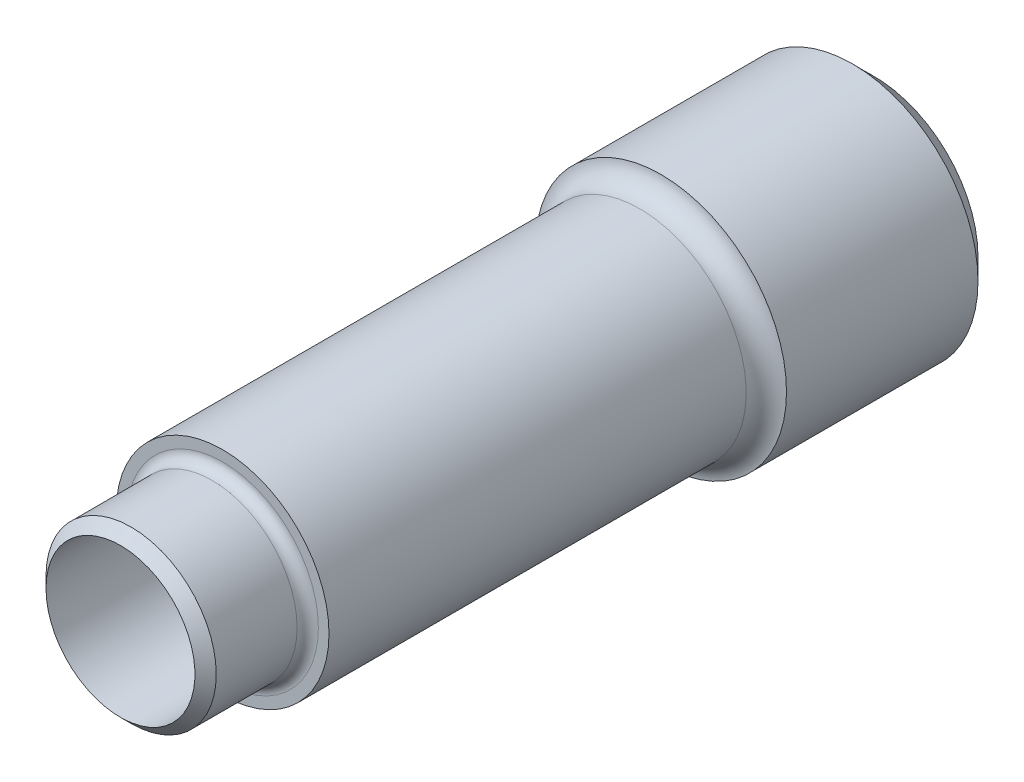
ISO-10303-21;
HEADER;
FILE_DESCRIPTION(('STEP AP214'),'2;1');
FILE_NAME('part.step','',(''),(''),'','','');
FILE_SCHEMA(('AUTOMOTIVE_DESIGN { 1 0 10303 214 1 1 1 1 }'));
ENDSEC;
DATA;
#1=APPLICATION_CONTEXT('core data for automotive mechanical design processes');
#2=APPLICATION_PROTOCOL_DEFINITION('international standard','automotive_design',2000,#1);
#3=PRODUCT_CONTEXT('',#1,'mechanical');
#4=PRODUCT('Part','Part','',(#3));
#5=PRODUCT_RELATED_PRODUCT_CATEGORY('part','',(#4));
#6=PRODUCT_DEFINITION_FORMATION('','',#4);
#7=PRODUCT_DEFINITION_CONTEXT('part definition',#1,'design');
#8=PRODUCT_DEFINITION('design','',#6,#7);
#9=PRODUCT_DEFINITION_SHAPE('','',#8);
#10=(LENGTH_UNIT() NAMED_UNIT(*) SI_UNIT(.MILLI.,.METRE.));
#11=(NAMED_UNIT(*) PLANE_ANGLE_UNIT() SI_UNIT($,.RADIAN.));
#12=(NAMED_UNIT(*) SI_UNIT($,.STERADIAN.) SOLID_ANGLE_UNIT());
#13=UNCERTAINTY_MEASURE_WITH_UNIT(LENGTH_MEASURE(1.E-05),#10,'distance_accuracy_value','');
#14=(GEOMETRIC_REPRESENTATION_CONTEXT(3) GLOBAL_UNCERTAINTY_ASSIGNED_CONTEXT((#13)) GLOBAL_UNIT_ASSIGNED_CONTEXT((#10,
#11,#12)) REPRESENTATION_CONTEXT('',''));
#15=CARTESIAN_POINT('',(0.,0.,0.));
#16=DIRECTION('',(0.,0.,1.));
#17=DIRECTION('',(1.,0.,0.));
#18=AXIS2_PLACEMENT_3D('',#15,#16,#17);
#19=CARTESIAN_POINT('',(0.,0.,89.916));
#20=DIRECTION('',(0.,0.,-1.));
#21=DIRECTION('',(-1.,0.,0.));
#22=AXIS2_PLACEMENT_3D('',#19,#20,#21);
#23=CYLINDRICAL_SURFACE('',#22,12.7);
#24=CARTESIAN_POINT('',(0.,0.,27.9272680902508));
#25=DIRECTION('',(0.,0.,-1.));
#26=DIRECTION('',(-1.,0.,0.));
#27=AXIS2_PLACEMENT_3D('',#24,#25,#26);
#28=CIRCLE('',#27,12.7);
#29=CARTESIAN_POINT('',(-12.7,0.,27.9272680902508));
#30=VERTEX_POINT('',#29);
#31=EDGE_CURVE('E47',#30,#30,#28,.F.);
#32=ORIENTED_EDGE('',*,*,#31,.T.);
#33=EDGE_LOOP('',(#32));
#34=FACE_BOUND('',#33,.T.);
#35=CARTESIAN_POINT('',(0.,0.,77.724));
#36=DIRECTION('',(0.,0.,1.));
#37=DIRECTION('',(1.,0.,0.));
#38=AXIS2_PLACEMENT_3D('',#35,#36,#37);
#39=CIRCLE('',#38,12.7);
#40=CARTESIAN_POINT('',(12.7,0.,77.724));
#41=VERTEX_POINT('',#40);
#42=EDGE_CURVE('E78',#41,#41,#39,.T.);
#43=ORIENTED_EDGE('',*,*,#42,.F.);
#44=EDGE_LOOP('',(#43));
#45=FACE_BOUND('',#44,.T.);
#46=ADVANCED_FACE('F35',(#34,#45),#23,.T.);
#47=CARTESIAN_POINT('',(0.,0.,89.916));
#48=DIRECTION('',(0.,0.,-1.));
#49=DIRECTION('',(-1.,0.,0.));
#50=AXIS2_PLACEMENT_3D('',#47,#48,#49);
#51=CYLINDRICAL_SURFACE('',#50,8.89);
#52=CARTESIAN_POINT('',(0.,0.,89.916));
#53=DIRECTION('',(0.,0.,-1.));
#54=DIRECTION('',(-1.,0.,0.));
#55=AXIS2_PLACEMENT_3D('',#52,#53,#54);
#56=CIRCLE('',#55,8.89);
#57=CARTESIAN_POINT('',(-8.89,0.,89.916));
#58=VERTEX_POINT('',#57);
#59=EDGE_CURVE('E74',#58,#58,#56,.T.);
#60=ORIENTED_EDGE('',*,*,#59,.F.);
#61=EDGE_LOOP('',(#60));
#62=FACE_BOUND('',#61,.T.);
#63=CARTESIAN_POINT('',(0.,0.,12.7));
#64=DIRECTION('',(0.,0.,-1.));
#65=DIRECTION('',(-1.,0.,0.));
#66=AXIS2_PLACEMENT_3D('',#63,#64,#65);
#67=CIRCLE('',#66,8.89);
#68=CARTESIAN_POINT('',(-8.89,0.,12.7));
#69=VERTEX_POINT('',#68);
#70=EDGE_CURVE('E75',#69,#69,#67,.F.);
#71=ORIENTED_EDGE('',*,*,#70,.F.);
#72=EDGE_LOOP('',(#71));
#73=FACE_BOUND('',#72,.T.);
#74=ADVANCED_FACE('F102',(#62,#73),#51,.F.);
#75=CARTESIAN_POINT('',(0.,0.,0.));
#76=DIRECTION('',(0.,0.,1.));
#77=DIRECTION('',(1.,0.,0.));
#78=AXIS2_PLACEMENT_3D('',#75,#76,#77);
#79=PLANE('',#78);
#80=CARTESIAN_POINT('',(0.,0.,0.));
#81=DIRECTION('',(0.,0.,1.));
#82=DIRECTION('',(1.,0.,0.));
#83=AXIS2_PLACEMENT_3D('',#80,#81,#82);
#84=CIRCLE('',#83,12.446);
#85=CARTESIAN_POINT('',(12.446,0.,0.));
#86=VERTEX_POINT('',#85);
#87=EDGE_CURVE('E43',#86,#86,#84,.F.);
#88=ORIENTED_EDGE('',*,*,#87,.T.);
#89=EDGE_LOOP('',(#88));
#90=FACE_BOUND('',#89,.T.);
#91=CARTESIAN_POINT('',(0.,0.,0.));
#92=DIRECTION('',(0.,0.,1.));
#93=DIRECTION('',(1.,0.,0.));
#94=AXIS2_PLACEMENT_3D('',#91,#92,#93);
#95=CIRCLE('',#94,11.303);
#96=CARTESIAN_POINT('',(11.303,0.,0.));
#97=VERTEX_POINT('',#96);
#98=EDGE_CURVE('E62',#97,#97,#95,.T.);
#99=ORIENTED_EDGE('',*,*,#98,.T.);
#100=EDGE_LOOP('',(#99));
#101=FACE_BOUND('',#100,.T.);
#102=ADVANCED_FACE('F108',(#90,#101),#79,.F.);
#103=CARTESIAN_POINT('',(0.,0.,12.7));
#104=DIRECTION('',(0.,0.,-1.));
#105=DIRECTION('',(-1.,0.,0.));
#106=AXIS2_PLACEMENT_3D('',#103,#104,#105);
#107=PLANE('',#106);
#108=CARTESIAN_POINT('',(0.,0.,12.7));
#109=DIRECTION('',(0.,0.,-1.));
#110=DIRECTION('',(-1.,0.,0.));
#111=AXIS2_PLACEMENT_3D('',#108,#109,#110);
#112=CIRCLE('',#111,9.398);
#113=CARTESIAN_POINT('',(-9.398,0.,12.7));
#114=VERTEX_POINT('',#113);
#115=EDGE_CURVE('E59',#114,#114,#112,.T.);
#116=ORIENTED_EDGE('',*,*,#115,.T.);
#117=EDGE_LOOP('',(#116));
#118=FACE_BOUND('',#117,.T.);
#119=ORIENTED_EDGE('',*,*,#70,.T.);
#120=EDGE_LOOP('',(#119));
#121=FACE_BOUND('',#120,.T.);
#122=ADVANCED_FACE('F142',(#118,#121),#107,.T.);
#123=CARTESIAN_POINT('',(0.,0.,12.7));
#124=DIRECTION('',(0.,0.,-1.));
#125=DIRECTION('',(-1.,0.,0.));
#126=AXIS2_PLACEMENT_3D('',#123,#124,#125);
#127=CYLINDRICAL_SURFACE('',#126,10.033);
#128=CARTESIAN_POINT('',(0.,0.,12.065));
#129=DIRECTION('',(0.,0.,-1.));
#130=DIRECTION('',(-1.,0.,0.));
#131=AXIS2_PLACEMENT_3D('',#128,#129,#130);
#132=CIRCLE('',#131,10.033);
#133=CARTESIAN_POINT('',(-10.033,0.,12.065));
#134=VERTEX_POINT('',#133);
#135=EDGE_CURVE('E56',#134,#134,#132,.F.);
#136=ORIENTED_EDGE('',*,*,#135,.T.);
#137=EDGE_LOOP('',(#136));
#138=FACE_BOUND('',#137,.T.);
#139=CARTESIAN_POINT('',(0.,0.,1.27000000000001));
#140=DIRECTION('',(0.,0.,1.));
#141=DIRECTION('',(1.,0.,0.));
#142=AXIS2_PLACEMENT_3D('',#139,#140,#141);
#143=CIRCLE('',#142,10.033);
#144=CARTESIAN_POINT('',(10.033,0.,1.27000000000001));
#145=VERTEX_POINT('',#144);
#146=EDGE_CURVE('E65',#145,#145,#143,.F.);
#147=ORIENTED_EDGE('',*,*,#146,.T.);
#148=EDGE_LOOP('',(#147));
#149=FACE_BOUND('',#148,.T.);
#150=ADVANCED_FACE('F144',(#138,#149),#127,.F.);
#151=CARTESIAN_POINT('',(0.,0.,77.724));
#152=DIRECTION('',(0.,0.,1.));
#153=DIRECTION('',(1.,0.,0.));
#154=AXIS2_PLACEMENT_3D('',#151,#152,#153);
#155=PLANE('',#154);
#156=CARTESIAN_POINT('',(0.,0.,77.724));
#157=DIRECTION('',(0.,0.,1.));
#158=DIRECTION('',(1.,0.,0.));
#159=AXIS2_PLACEMENT_3D('',#156,#157,#158);
#160=CIRCLE('',#159,11.43);
#161=CARTESIAN_POINT('',(11.43,0.,77.724));
#162=VERTEX_POINT('',#161);
#163=EDGE_CURVE('E68',#162,#162,#160,.F.);
#164=ORIENTED_EDGE('',*,*,#163,.T.);
#165=EDGE_LOOP('',(#164));
#166=FACE_BOUND('',#165,.T.);
#167=ORIENTED_EDGE('',*,*,#42,.T.);
#168=EDGE_LOOP('',(#167));
#169=FACE_BOUND('',#168,.T.);
#170=ADVANCED_FACE('F151',(#166,#169),#155,.T.);
#171=CARTESIAN_POINT('',(0.,0.,77.724));
#172=DIRECTION('',(0.,0.,1.));
#173=DIRECTION('',(1.,0.,0.));
#174=AXIS2_PLACEMENT_3D('',#171,#172,#173);
#175=CYLINDRICAL_SURFACE('',#174,10.16);
#176=CARTESIAN_POINT('',(0.,0.,88.646));
#177=DIRECTION('',(0.,0.,1.));
#178=DIRECTION('',(1.,0.,0.));
#179=AXIS2_PLACEMENT_3D('',#176,#177,#178);
#180=CIRCLE('',#179,10.16);
#181=CARTESIAN_POINT('',(10.16,0.,88.646));
#182=VERTEX_POINT('',#181);
#183=EDGE_CURVE('E51',#182,#182,#180,.F.);
#184=CARTESIAN_POINT('',(0.,0.,78.994));
#185=DIRECTION('',(0.,0.,1.));
#186=DIRECTION('',(1.,0.,0.));
#187=AXIS2_PLACEMENT_3D('',#184,#185,#186);
#188=CIRCLE('',#187,10.16);
#189=CARTESIAN_POINT('',(10.16,0.,78.994));
#190=VERTEX_POINT('',#189);
#191=EDGE_CURVE('E71',#190,#190,#188,.T.);
#192=CARTESIAN_POINT('',(10.16,0.,88.646));
#193=CARTESIAN_POINT('',(10.16,0.,88.5454583333334));
#194=CARTESIAN_POINT('',(10.16,0.,88.4449166666667));
#195=CARTESIAN_POINT('',(10.16,0.,88.2438333333334));
#196=CARTESIAN_POINT('',(10.16,0.,88.1432916666667));
#197=CARTESIAN_POINT('',(10.16,0.,87.9422083333334));
#198=CARTESIAN_POINT('',(10.16,0.,87.8416666666667));
#199=CARTESIAN_POINT('',(10.16,0.,87.6405833333334));
#200=CARTESIAN_POINT('',(10.16,0.,87.5400416666667));
#201=CARTESIAN_POINT('',(10.16,0.,87.3389583333334));
#202=CARTESIAN_POINT('',(10.16,0.,87.2384166666667));
#203=CARTESIAN_POINT('',(10.16,0.,87.0373333333334));
#204=CARTESIAN_POINT('',(10.16,0.,86.9367916666667));
#205=CARTESIAN_POINT('',(10.16,0.,86.7357083333334));
#206=CARTESIAN_POINT('',(10.16,0.,86.6351666666667));
#207=CARTESIAN_POINT('',(10.16,0.,86.4340833333334));
#208=CARTESIAN_POINT('',(10.16,0.,86.3335416666667));
#209=CARTESIAN_POINT('',(10.16,0.,86.1324583333334));
#210=CARTESIAN_POINT('',(10.16,0.,86.0319166666667));
#211=CARTESIAN_POINT('',(10.16,0.,85.8308333333334));
#212=CARTESIAN_POINT('',(10.16,0.,85.7302916666667));
#213=CARTESIAN_POINT('',(10.16,0.,85.5292083333334));
#214=CARTESIAN_POINT('',(10.16,0.,85.4286666666667));
#215=CARTESIAN_POINT('',(10.16,0.,85.2275833333334));
#216=CARTESIAN_POINT('',(10.16,0.,85.1270416666667));
#217=CARTESIAN_POINT('',(10.16,0.,84.9259583333334));
#218=CARTESIAN_POINT('',(10.16,0.,84.8254166666667));
#219=CARTESIAN_POINT('',(10.16,0.,84.6243333333334));
#220=CARTESIAN_POINT('',(10.16,0.,84.5237916666667));
#221=CARTESIAN_POINT('',(10.16,0.,84.3227083333334));
#222=CARTESIAN_POINT('',(10.16,0.,84.2221666666667));
#223=CARTESIAN_POINT('',(10.16,0.,84.0210833333334));
#224=CARTESIAN_POINT('',(10.16,0.,83.9205416666667));
#225=CARTESIAN_POINT('',(10.16,0.,83.7194583333333));
#226=CARTESIAN_POINT('',(10.16,0.,83.6189166666667));
#227=CARTESIAN_POINT('',(10.16,0.,83.4178333333333));
#228=CARTESIAN_POINT('',(10.16,0.,83.3172916666667));
#229=CARTESIAN_POINT('',(10.16,0.,83.1162083333333));
#230=CARTESIAN_POINT('',(10.16,0.,83.0156666666667));
#231=CARTESIAN_POINT('',(10.16,0.,82.8145833333333));
#232=CARTESIAN_POINT('',(10.16,0.,82.7140416666667));
#233=CARTESIAN_POINT('',(10.16,0.,82.5129583333333));
#234=CARTESIAN_POINT('',(10.16,0.,82.4124166666667));
#235=CARTESIAN_POINT('',(10.16,0.,82.2113333333333));
#236=CARTESIAN_POINT('',(10.16,0.,82.1107916666667));
#237=CARTESIAN_POINT('',(10.16,0.,81.9097083333333));
#238=CARTESIAN_POINT('',(10.16,0.,81.8091666666667));
#239=CARTESIAN_POINT('',(10.16,0.,81.6080833333333));
#240=CARTESIAN_POINT('',(10.16,0.,81.5075416666667));
#241=CARTESIAN_POINT('',(10.16,0.,81.3064583333333));
#242=CARTESIAN_POINT('',(10.16,0.,81.2059166666667));
#243=CARTESIAN_POINT('',(10.16,0.,81.0048333333333));
#244=CARTESIAN_POINT('',(10.16,0.,80.9042916666667));
#245=CARTESIAN_POINT('',(10.16,0.,80.7032083333333));
#246=CARTESIAN_POINT('',(10.16,0.,80.6026666666667));
#247=CARTESIAN_POINT('',(10.16,0.,80.4015833333333));
#248=CARTESIAN_POINT('',(10.16,0.,80.3010416666667));
#249=CARTESIAN_POINT('',(10.16,0.,80.0999583333333));
#250=CARTESIAN_POINT('',(10.16,0.,79.9994166666667));
#251=CARTESIAN_POINT('',(10.16,0.,79.7983333333333));
#252=CARTESIAN_POINT('',(10.16,0.,79.6977916666667));
#253=CARTESIAN_POINT('',(10.16,0.,79.4967083333333));
#254=CARTESIAN_POINT('',(10.16,0.,79.3961666666667));
#255=CARTESIAN_POINT('',(10.16,0.,79.1950833333333));
#256=CARTESIAN_POINT('',(10.16,0.,79.0945416666667));
#257=CARTESIAN_POINT('',(10.16,0.,78.994));
#258=B_SPLINE_CURVE_WITH_KNOTS('',3,(#192,#193,#194,#195,#196,#197,#198,#199,#200,#201,#202,
#203,#204,#205,#206,#207,#208,#209,#210,#211,#212,#213,#214,#215,#216,#217,#218,#219,#220,#221,
#222,#223,#224,#225,#226,#227,#228,#229,#230,#231,#232,#233,#234,#235,#236,#237,#238,#239,#240,
#241,#242,#243,#244,#245,#246,#247,#248,#249,#250,#251,#252,#253,#254,#255,#256,#257),
.UNSPECIFIED.,.F.,.F.,(4,2,2,2,2,2,2,2,2,2,2,2,2,2,2,2,2,2,2,2,2,2,2,2,2,2,2,2,2,2,2,2,4),(0.,
0.301625000000014,0.603250000000013,0.904875000000013,1.20650000000001,1.50812500000001,
1.80975000000001,2.11137500000001,2.41300000000001,2.71462500000003,3.01625000000003,
3.31787500000003,3.61950000000003,3.92112500000003,4.22275000000003,4.52437500000002,
4.82600000000002,5.12762500000004,5.42925000000004,5.73087500000004,6.03250000000004,
6.33412500000004,6.63575000000004,6.93737500000004,7.23900000000004,7.54062500000005,
7.84225000000005,8.14387500000005,8.44550000000005,8.74712500000005,9.04875000000005,
9.35037500000005,9.65200000000006),.UNSPECIFIED.);
#259=EDGE_CURVE('BSEAM118',#182,#190,#258,.T.);
#260=ORIENTED_EDGE('',*,*,#183,.T.);
#261=ORIENTED_EDGE('',*,*,#191,.T.);
#262=ORIENTED_EDGE('',*,*,#259,.T.);
#263=ORIENTED_EDGE('',*,*,#259,.F.);
#264=EDGE_LOOP('',(#260,#262,#261,#263));
#265=FACE_BOUND('',#264,.T.);
#266=ADVANCED_FACE('F118',(#265),#175,.T.);
#267=CARTESIAN_POINT('',(0.,0.,78.994));
#268=DIRECTION('',(0.,0.,1.));
#269=DIRECTION('',(1.,0.,0.));
#270=AXIS2_PLACEMENT_3D('',#267,#268,#269);
#271=TOROIDAL_SURFACE('',#270,11.43,1.27);
#272=ORIENTED_EDGE('',*,*,#163,.F.);
#273=EDGE_LOOP('',(#272));
#274=FACE_BOUND('',#273,.T.);
#275=ORIENTED_EDGE('',*,*,#191,.F.);
#276=EDGE_LOOP('',(#275));
#277=FACE_BOUND('',#276,.T.);
#278=ADVANCED_FACE('F114',(#274,#277),#271,.F.);
#279=CARTESIAN_POINT('',(0.,0.,1.27000000000001));
#280=DIRECTION('',(0.,0.,-1.));
#281=DIRECTION('',(-1.,0.,0.));
#282=AXIS2_PLACEMENT_3D('',#279,#280,#281);
#283=CONICAL_SURFACE('',#282,10.033,0.785398163397451);
#284=ORIENTED_EDGE('',*,*,#98,.F.);
#285=EDGE_LOOP('',(#284));
#286=FACE_BOUND('',#285,.T.);
#287=ORIENTED_EDGE('',*,*,#146,.F.);
#288=EDGE_LOOP('',(#287));
#289=FACE_BOUND('',#288,.T.);
#290=ADVANCED_FACE('F117',(#286,#289),#283,.F.);
#291=CARTESIAN_POINT('',(0.,0.,12.065));
#292=DIRECTION('',(0.,0.,-1.));
#293=DIRECTION('',(-1.,0.,0.));
#294=AXIS2_PLACEMENT_3D('',#291,#292,#293);
#295=TOROIDAL_SURFACE('',#294,9.398,0.635);
#296=ORIENTED_EDGE('',*,*,#135,.F.);
#297=EDGE_LOOP('',(#296));
#298=FACE_BOUND('',#297,.T.);
#299=ORIENTED_EDGE('',*,*,#115,.F.);
#300=EDGE_LOOP('',(#299));
#301=FACE_BOUND('',#300,.T.);
#302=ADVANCED_FACE('F126',(#298,#301),#295,.F.);
#303=CARTESIAN_POINT('',(0.,0.,89.916));
#304=DIRECTION('',(0.,0.,-1.));
#305=DIRECTION('',(-1.,0.,0.));
#306=AXIS2_PLACEMENT_3D('',#303,#304,#305);
#307=CONICAL_SURFACE('',#306,8.89000000000003,0.785398163397453);
#308=ORIENTED_EDGE('',*,*,#183,.F.);
#309=EDGE_LOOP('',(#308));
#310=FACE_BOUND('',#309,.T.);
#311=ORIENTED_EDGE('',*,*,#59,.T.);
#312=EDGE_LOOP('',(#311));
#313=FACE_BOUND('',#312,.T.);
#314=ADVANCED_FACE('F97',(#310,#313),#307,.T.);
#315=CARTESIAN_POINT('',(0.,0.,25.4));
#316=DIRECTION('',(0.,0.,-1.));
#317=DIRECTION('',(-1.,0.,0.));
#318=AXIS2_PLACEMENT_3D('',#315,#316,#317);
#319=CYLINDRICAL_SURFACE('',#318,14.986);
#320=CARTESIAN_POINT('',(0.,0.,2.54000000000002));
#321=DIRECTION('',(0.,0.,1.));
#322=DIRECTION('',(1.,0.,0.));
#323=AXIS2_PLACEMENT_3D('',#320,#321,#322);
#324=CIRCLE('',#323,14.986);
#325=CARTESIAN_POINT('',(14.986,0.,2.54000000000002));
#326=VERTEX_POINT('',#325);
#327=EDGE_CURVE('E10',#326,#326,#324,.T.);
#328=ORIENTED_EDGE('',*,*,#327,.T.);
#329=EDGE_LOOP('',(#328));
#330=FACE_BOUND('',#329,.T.);
#331=CARTESIAN_POINT('',(0.,0.,25.4));
#332=DIRECTION('',(0.,0.,-1.));
#333=DIRECTION('',(-1.,0.,0.));
#334=AXIS2_PLACEMENT_3D('',#331,#332,#333);
#335=CIRCLE('',#334,14.986);
#336=CARTESIAN_POINT('',(-14.986,0.,25.4));
#337=VERTEX_POINT('',#336);
#338=EDGE_CURVE('E83',#337,#337,#335,.T.);
#339=ORIENTED_EDGE('',*,*,#338,.T.);
#340=EDGE_LOOP('',(#339));
#341=FACE_BOUND('',#340,.T.);
#342=ADVANCED_FACE('F87',(#330,#341),#319,.T.);
#343=CARTESIAN_POINT('',(0.,0.,27.9272680902508));
#344=DIRECTION('',(0.,0.,-1.));
#345=DIRECTION('',(-1.,0.,0.));
#346=AXIS2_PLACEMENT_3D('',#343,#344,#345);
#347=TOROIDAL_SURFACE('',#346,15.24,2.54);
#348=ORIENTED_EDGE('',*,*,#31,.F.);
#349=EDGE_LOOP('',(#348));
#350=FACE_BOUND('',#349,.T.);
#351=ORIENTED_EDGE('',*,*,#338,.F.);
#352=EDGE_LOOP('',(#351));
#353=FACE_BOUND('',#352,.T.);
#354=ADVANCED_FACE('F89',(#350,#353),#347,.F.);
#355=CARTESIAN_POINT('',(0.,0.,0.));
#356=DIRECTION('',(0.,0.,1.));
#357=DIRECTION('',(1.,0.,0.));
#358=AXIS2_PLACEMENT_3D('',#355,#356,#357);
#359=CONICAL_SURFACE('',#358,12.446,0.785398163397447);
#360=CARTESIAN_POINT('',(14.986,0.,2.54000000000002));
#361=CARTESIAN_POINT('',(14.9595416666667,0.,2.51354166666669));
#362=CARTESIAN_POINT('',(14.9330833333333,0.,2.48708333333335));
#363=CARTESIAN_POINT('',(14.8801666666667,0.,2.43416666666669));
#364=CARTESIAN_POINT('',(14.8537083333333,0.,2.40770833333335));
#365=CARTESIAN_POINT('',(14.8007916666667,0.,2.35479166666669));
#366=CARTESIAN_POINT('',(14.7743333333333,0.,2.32833333333335));
#367=CARTESIAN_POINT('',(14.7214166666667,0.,2.27541666666669));
#368=CARTESIAN_POINT('',(14.6949583333333,0.,2.24895833333335));
#369=CARTESIAN_POINT('',(14.6420416666667,0.,2.19604166666668));
#370=CARTESIAN_POINT('',(14.6155833333333,0.,2.16958333333335));
#371=CARTESIAN_POINT('',(14.5626666666667,0.,2.11666666666668));
#372=CARTESIAN_POINT('',(14.5362083333333,0.,2.09020833333335));
#373=CARTESIAN_POINT('',(14.4832916666667,0.,2.03729166666668));
#374=CARTESIAN_POINT('',(14.4568333333333,0.,2.01083333333335));
#375=CARTESIAN_POINT('',(14.4039166666667,0.,1.95791666666668));
#376=CARTESIAN_POINT('',(14.3774583333333,0.,1.93145833333335));
#377=CARTESIAN_POINT('',(14.3245416666667,0.,1.87854166666668));
#378=CARTESIAN_POINT('',(14.2980833333333,0.,1.85208333333335));
#379=CARTESIAN_POINT('',(14.2451666666667,0.,1.79916666666668));
#380=CARTESIAN_POINT('',(14.2187083333333,0.,1.77270833333335));
#381=CARTESIAN_POINT('',(14.1657916666667,0.,1.71979166666668));
#382=CARTESIAN_POINT('',(14.1393333333333,0.,1.69333333333335));
#383=CARTESIAN_POINT('',(14.0864166666667,0.,1.64041666666668));
#384=CARTESIAN_POINT('',(14.0599583333333,0.,1.61395833333335));
#385=CARTESIAN_POINT('',(14.0070416666667,0.,1.56104166666668));
#386=CARTESIAN_POINT('',(13.9805833333333,0.,1.53458333333335));
#387=CARTESIAN_POINT('',(13.9276666666667,0.,1.48166666666668));
#388=CARTESIAN_POINT('',(13.9012083333333,0.,1.45520833333335));
#389=CARTESIAN_POINT('',(13.8482916666667,0.,1.40229166666668));
#390=CARTESIAN_POINT('',(13.8218333333333,0.,1.37583333333334));
#391=CARTESIAN_POINT('',(13.7689166666667,0.,1.32291666666668));
#392=CARTESIAN_POINT('',(13.7424583333333,0.,1.29645833333334));
#393=CARTESIAN_POINT('',(13.6895416666667,0.,1.24354166666668));
#394=CARTESIAN_POINT('',(13.6630833333333,0.,1.21708333333334));
#395=CARTESIAN_POINT('',(13.6101666666667,0.,1.16416666666668));
#396=CARTESIAN_POINT('',(13.5837083333333,0.,1.13770833333334));
#397=CARTESIAN_POINT('',(13.5307916666667,0.,1.08479166666668));
#398=CARTESIAN_POINT('',(13.5043333333333,0.,1.05833333333334));
#399=CARTESIAN_POINT('',(13.4514166666667,0.,1.00541666666668));
#400=CARTESIAN_POINT('',(13.4249583333333,0.,0.978958333333341));
#401=CARTESIAN_POINT('',(13.3720416666667,0.,0.926041666666674));
#402=CARTESIAN_POINT('',(13.3455833333333,0.,0.899583333333341));
#403=CARTESIAN_POINT('',(13.2926666666667,0.,0.846666666666674));
#404=CARTESIAN_POINT('',(13.2662083333333,0.,0.82020833333334));
#405=CARTESIAN_POINT('',(13.2132916666667,0.,0.767291666666673));
#406=CARTESIAN_POINT('',(13.1868333333333,0.,0.74083333333334));
#407=CARTESIAN_POINT('',(13.1339166666667,0.,0.687916666666673));
#408=CARTESIAN_POINT('',(13.1074583333333,0.,0.661458333333339));
#409=CARTESIAN_POINT('',(13.0545416666667,0.,0.608541666666672));
#410=CARTESIAN_POINT('',(13.0280833333333,0.,0.582083333333338));
#411=CARTESIAN_POINT('',(12.9751666666667,0.,0.529166666666671));
#412=CARTESIAN_POINT('',(12.9487083333333,0.,0.502708333333337));
#413=CARTESIAN_POINT('',(12.8957916666667,0.,0.44979166666667));
#414=CARTESIAN_POINT('',(12.8693333333333,0.,0.423333333333337));
#415=CARTESIAN_POINT('',(12.8164166666667,0.,0.37041666666667));
#416=CARTESIAN_POINT('',(12.7899583333333,0.,0.343958333333336));
#417=CARTESIAN_POINT('',(12.7370416666667,0.,0.291041666666669));
#418=CARTESIAN_POINT('',(12.7105833333333,0.,0.264583333333336));
#419=CARTESIAN_POINT('',(12.6576666666667,0.,0.211666666666668));
#420=CARTESIAN_POINT('',(12.6312083333333,0.,0.185208333333335));
#421=CARTESIAN_POINT('',(12.5782916666667,0.,0.132291666666668));
#422=CARTESIAN_POINT('',(12.5518333333333,0.,0.105833333333334));
#423=CARTESIAN_POINT('',(12.4989166666667,0.,0.0529166666666671));
#424=CARTESIAN_POINT('',(12.4724583333333,0.,0.0264583333333337));
#425=CARTESIAN_POINT('',(12.446,0.,0.));
#426=B_SPLINE_CURVE_WITH_KNOTS('',3,(#360,#361,#362,#363,#364,#365,#366,#367,#368,#369,#370,
#371,#372,#373,#374,#375,#376,#377,#378,#379,#380,#381,#382,#383,#384,#385,#386,#387,#388,#389,
#390,#391,#392,#393,#394,#395,#396,#397,#398,#399,#400,#401,#402,#403,#404,#405,#406,#407,#408,
#409,#410,#411,#412,#413,#414,#415,#416,#417,#418,#419,#420,#421,#422,#423,#424,#425),
.UNSPECIFIED.,.F.,.F.,(4,2,2,2,2,2,2,2,2,2,2,2,2,2,2,2,2,2,2,2,2,2,2,2,2,2,2,2,2,2,2,2,4),(0.,
0.112253201513364,0.22450640302673,0.336759604540096,0.449012806053461,0.561266007566825,
0.673519209080191,0.785772410593557,0.898025612106922,1.01027881362029,1.12253201513365,
1.23478521664702,1.34703841816038,1.45929161967375,1.57154482118711,1.68379802270048,
1.79605122421384,1.90830442572721,2.02055762724057,2.13281082875394,2.2450640302673,
2.35731723178067,2.46957043329403,2.5818236348074,2.69407683632076,2.80633003783413,
2.91858323934749,3.03083644086086,3.14308964237422,3.25534284388759,3.36759604540096,
3.47984924691432,3.59210244842769),.UNSPECIFIED.);
#427=EDGE_CURVE('BSEAM38',#326,#86,#426,.T.);
#428=ORIENTED_EDGE('',*,*,#327,.F.);
#429=ORIENTED_EDGE('',*,*,#87,.F.);
#430=ORIENTED_EDGE('',*,*,#427,.T.);
#431=ORIENTED_EDGE('',*,*,#427,.F.);
#432=EDGE_LOOP('',(#428,#430,#429,#431));
#433=FACE_BOUND('',#432,.T.);
#434=ADVANCED_FACE('F38',(#433),#359,.T.);
#435=CLOSED_SHELL('',(#46,#74,#102,#122,#150,#170,#266,#278,#290,#302,#314,#342,#354,#434));
#436=MANIFOLD_SOLID_BREP('B2',#435);
#437=ADVANCED_BREP_SHAPE_REPRESENTATION('',(#18,#436),#14);
#438=SHAPE_DEFINITION_REPRESENTATION(#9,#437);
ENDSEC;
END-ISO-10303-21;
